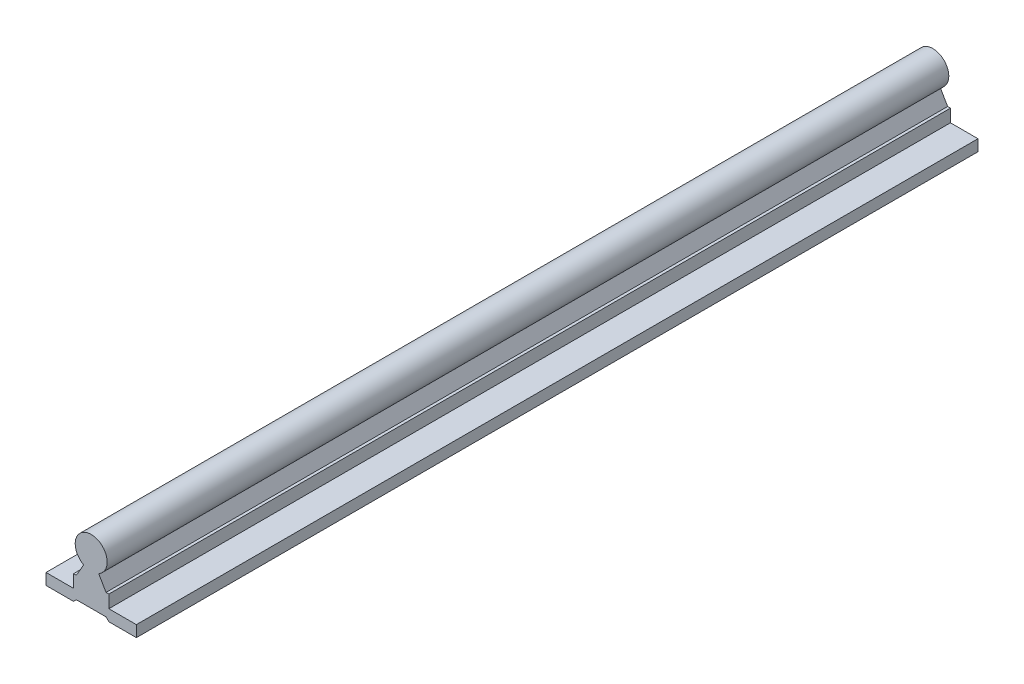
ISO-10303-21;
HEADER;
FILE_DESCRIPTION(('STEP AP214'),'2;1');
FILE_NAME('part.step','',(''),(''),'','','');
FILE_SCHEMA(('AUTOMOTIVE_DESIGN { 1 0 10303 214 1 1 1 1 }'));
ENDSEC;
DATA;
#1=APPLICATION_CONTEXT('core data for automotive mechanical design processes');
#2=APPLICATION_PROTOCOL_DEFINITION('international standard','automotive_design',2000,#1);
#3=PRODUCT_CONTEXT('',#1,'mechanical');
#4=PRODUCT('Part','Part','',(#3));
#5=PRODUCT_RELATED_PRODUCT_CATEGORY('part','',(#4));
#6=PRODUCT_DEFINITION_FORMATION('','',#4);
#7=PRODUCT_DEFINITION_CONTEXT('part definition',#1,'design');
#8=PRODUCT_DEFINITION('design','',#6,#7);
#9=PRODUCT_DEFINITION_SHAPE('','',#8);
#10=(LENGTH_UNIT() NAMED_UNIT(*) SI_UNIT(.MILLI.,.METRE.));
#11=(NAMED_UNIT(*) PLANE_ANGLE_UNIT() SI_UNIT($,.RADIAN.));
#12=(NAMED_UNIT(*) SI_UNIT($,.STERADIAN.) SOLID_ANGLE_UNIT());
#13=UNCERTAINTY_MEASURE_WITH_UNIT(LENGTH_MEASURE(1.E-05),#10,'distance_accuracy_value','');
#14=(GEOMETRIC_REPRESENTATION_CONTEXT(3) GLOBAL_UNCERTAINTY_ASSIGNED_CONTEXT((#13)) GLOBAL_UNIT_ASSIGNED_CONTEXT((#10,
#11,#12)) REPRESENTATION_CONTEXT('',''));
#15=CARTESIAN_POINT('',(0.,0.,0.));
#16=DIRECTION('',(0.,0.,1.));
#17=DIRECTION('',(1.,0.,0.));
#18=AXIS2_PLACEMENT_3D('',#15,#16,#17);
#19=CARTESIAN_POINT('',(-16.,0.,149.));
#20=DIRECTION('',(0.,1.,0.));
#21=DIRECTION('',(0.,0.,1.));
#22=AXIS2_PLACEMENT_3D('',#19,#20,#21);
#23=PLANE('',#22);
#24=DIRECTION('',(1.,0.,0.));
#25=VECTOR('',#24,1.);
#26=CARTESIAN_POINT('',(-16.,0.,-149.));
#27=LINE('',#26,#25);
#28=CARTESIAN_POINT('',(-16.,0.,-149.));
#29=VERTEX_POINT('',#28);
#30=CARTESIAN_POINT('',(-6.25,0.,-149.));
#31=VERTEX_POINT('',#30);
#32=EDGE_CURVE('E231',#29,#31,#27,.T.);
#33=ORIENTED_EDGE('',*,*,#32,.T.);
#34=DIRECTION('',(0.,0.,1.));
#35=VECTOR('',#34,1.);
#36=CARTESIAN_POINT('',(-6.25,0.,149.));
#37=LINE('',#36,#35);
#38=CARTESIAN_POINT('',(-6.25,0.,149.));
#39=VERTEX_POINT('',#38);
#40=EDGE_CURVE('E11',#31,#39,#37,.T.);
#41=ORIENTED_EDGE('',*,*,#40,.T.);
#42=DIRECTION('',(1.,0.,0.));
#43=VECTOR('',#42,1.);
#44=CARTESIAN_POINT('',(-16.,0.,149.));
#45=LINE('',#44,#43);
#46=CARTESIAN_POINT('',(-16.,0.,149.));
#47=VERTEX_POINT('',#46);
#48=EDGE_CURVE('E255',#47,#39,#45,.T.);
#49=ORIENTED_EDGE('',*,*,#48,.F.);
#50=DIRECTION('',(0.,0.,-1.));
#51=VECTOR('',#50,1.);
#52=CARTESIAN_POINT('',(-16.,0.,149.));
#53=LINE('',#52,#51);
#54=EDGE_CURVE('E173',#47,#29,#53,.T.);
#55=ORIENTED_EDGE('',*,*,#54,.T.);
#56=EDGE_LOOP('',(#33,#41,#49,#55));
#57=FACE_BOUND('',#56,.T.);
#58=ADVANCED_FACE('F35',(#57),#23,.F.);
#59=CARTESIAN_POINT('',(-16.,0.,149.));
#60=DIRECTION('',(1.,0.,0.));
#61=DIRECTION('',(0.,0.,-1.));
#62=AXIS2_PLACEMENT_3D('',#59,#60,#61);
#63=PLANE('',#62);
#64=DIRECTION('',(0.,-1.,0.));
#65=VECTOR('',#64,1.);
#66=CARTESIAN_POINT('',(-16.,0.,-149.));
#67=LINE('',#66,#65);
#68=CARTESIAN_POINT('',(-16.,4.,-149.));
#69=VERTEX_POINT('',#68);
#70=EDGE_CURVE('E159',#69,#29,#67,.T.);
#71=ORIENTED_EDGE('',*,*,#70,.T.);
#72=ORIENTED_EDGE('',*,*,#54,.F.);
#73=DIRECTION('',(0.,-1.,0.));
#74=VECTOR('',#73,1.);
#75=CARTESIAN_POINT('',(-16.,0.,149.));
#76=LINE('',#75,#74);
#77=CARTESIAN_POINT('',(-16.,4.,149.));
#78=VERTEX_POINT('',#77);
#79=EDGE_CURVE('E212',#78,#47,#76,.T.);
#80=ORIENTED_EDGE('',*,*,#79,.F.);
#81=DIRECTION('',(0.,0.,-1.));
#82=VECTOR('',#81,1.);
#83=CARTESIAN_POINT('',(-16.,4.,149.));
#84=LINE('',#83,#82);
#85=EDGE_CURVE('E206',#78,#69,#84,.T.);
#86=ORIENTED_EDGE('',*,*,#85,.T.);
#87=EDGE_LOOP('',(#71,#72,#80,#86));
#88=FACE_BOUND('',#87,.T.);
#89=ADVANCED_FACE('F271',(#88),#63,.F.);
#90=CARTESIAN_POINT('',(6.25,0.,149.));
#91=VERTEX_POINT('',#90);
#92=CARTESIAN_POINT('',(16.,0.,149.));
#93=VERTEX_POINT('',#92);
#94=EDGE_CURVE('E258',#91,#93,#45,.T.);
#95=ORIENTED_EDGE('',*,*,#94,.F.);
#96=DIRECTION('',(0.,0.,-1.));
#97=VECTOR('',#96,1.);
#98=CARTESIAN_POINT('',(6.25,0.,149.));
#99=LINE('',#98,#97);
#100=CARTESIAN_POINT('',(6.25,0.,-149.));
#101=VERTEX_POINT('',#100);
#102=EDGE_CURVE('E58',#91,#101,#99,.T.);
#103=ORIENTED_EDGE('',*,*,#102,.T.);
#104=CARTESIAN_POINT('',(16.,0.,-149.));
#105=VERTEX_POINT('',#104);
#106=EDGE_CURVE('E233',#101,#105,#27,.T.);
#107=ORIENTED_EDGE('',*,*,#106,.T.);
#108=DIRECTION('',(0.,0.,-1.));
#109=VECTOR('',#108,1.);
#110=CARTESIAN_POINT('',(16.,0.,149.));
#111=LINE('',#110,#109);
#112=EDGE_CURVE('E176',#93,#105,#111,.T.);
#113=ORIENTED_EDGE('',*,*,#112,.F.);
#114=EDGE_LOOP('',(#95,#103,#107,#113));
#115=FACE_BOUND('',#114,.T.);
#116=ADVANCED_FACE('F322',(#115),#23,.F.);
#117=CARTESIAN_POINT('',(16.,0.,149.));
#118=DIRECTION('',(-1.,0.,0.));
#119=DIRECTION('',(0.,0.,1.));
#120=AXIS2_PLACEMENT_3D('',#117,#118,#119);
#121=PLANE('',#120);
#122=DIRECTION('',(0.,1.,0.));
#123=VECTOR('',#122,1.);
#124=CARTESIAN_POINT('',(16.,0.,-149.));
#125=LINE('',#124,#123);
#126=CARTESIAN_POINT('',(16.,4.,-149.));
#127=VERTEX_POINT('',#126);
#128=EDGE_CURVE('E229',#105,#127,#125,.T.);
#129=ORIENTED_EDGE('',*,*,#128,.T.);
#130=DIRECTION('',(0.,0.,-1.));
#131=VECTOR('',#130,1.);
#132=CARTESIAN_POINT('',(16.,4.,149.));
#133=LINE('',#132,#131);
#134=CARTESIAN_POINT('',(16.,4.,149.));
#135=VERTEX_POINT('',#134);
#136=EDGE_CURVE('E179',#135,#127,#133,.T.);
#137=ORIENTED_EDGE('',*,*,#136,.F.);
#138=DIRECTION('',(0.,1.,0.));
#139=VECTOR('',#138,1.);
#140=CARTESIAN_POINT('',(16.,0.,149.));
#141=LINE('',#140,#139);
#142=EDGE_CURVE('E253',#93,#135,#141,.T.);
#143=ORIENTED_EDGE('',*,*,#142,.F.);
#144=ORIENTED_EDGE('',*,*,#112,.T.);
#145=EDGE_LOOP('',(#129,#137,#143,#144));
#146=FACE_BOUND('',#145,.T.);
#147=ADVANCED_FACE('F320',(#146),#121,.F.);
#148=CARTESIAN_POINT('',(6.25,4.,149.));
#149=DIRECTION('',(0.,-1.,0.));
#150=DIRECTION('',(0.,0.,-1.));
#151=AXIS2_PLACEMENT_3D('',#148,#149,#150);
#152=PLANE('',#151);
#153=DIRECTION('',(-1.,0.,0.));
#154=VECTOR('',#153,1.);
#155=CARTESIAN_POINT('',(6.25,4.,-149.));
#156=LINE('',#155,#154);
#157=CARTESIAN_POINT('',(6.25,4.,-149.));
#158=VERTEX_POINT('',#157);
#159=EDGE_CURVE('E227',#127,#158,#156,.T.);
#160=ORIENTED_EDGE('',*,*,#159,.T.);
#161=DIRECTION('',(0.,0.,-1.));
#162=VECTOR('',#161,1.);
#163=CARTESIAN_POINT('',(6.25,4.,149.));
#164=LINE('',#163,#162);
#165=CARTESIAN_POINT('',(6.25,4.,149.));
#166=VERTEX_POINT('',#165);
#167=EDGE_CURVE('E182',#166,#158,#164,.T.);
#168=ORIENTED_EDGE('',*,*,#167,.F.);
#169=DIRECTION('',(-1.,0.,0.));
#170=VECTOR('',#169,1.);
#171=CARTESIAN_POINT('',(6.25,4.,149.));
#172=LINE('',#171,#170);
#173=EDGE_CURVE('E251',#135,#166,#172,.T.);
#174=ORIENTED_EDGE('',*,*,#173,.F.);
#175=ORIENTED_EDGE('',*,*,#136,.T.);
#176=EDGE_LOOP('',(#160,#168,#174,#175));
#177=FACE_BOUND('',#176,.T.);
#178=ADVANCED_FACE('F315',(#177),#152,.F.);
#179=CARTESIAN_POINT('',(6.25,4.,149.));
#180=DIRECTION('',(-1.,0.,0.));
#181=DIRECTION('',(0.,-1.,0.));
#182=AXIS2_PLACEMENT_3D('',#179,#180,#181);
#183=PLANE('',#182);
#184=DIRECTION('',(0.,1.,0.));
#185=VECTOR('',#184,1.);
#186=CARTESIAN_POINT('',(6.25,4.,-149.));
#187=LINE('',#186,#185);
#188=CARTESIAN_POINT('',(6.25,8.5,-149.));
#189=VERTEX_POINT('',#188);
#190=EDGE_CURVE('E225',#158,#189,#187,.T.);
#191=ORIENTED_EDGE('',*,*,#190,.T.);
#192=DIRECTION('',(0.,0.,-1.));
#193=VECTOR('',#192,1.);
#194=CARTESIAN_POINT('',(6.25,8.5,149.));
#195=LINE('',#194,#193);
#196=CARTESIAN_POINT('',(6.25,8.5,149.));
#197=VERTEX_POINT('',#196);
#198=EDGE_CURVE('E185',#197,#189,#195,.T.);
#199=ORIENTED_EDGE('',*,*,#198,.F.);
#200=DIRECTION('',(0.,1.,0.));
#201=VECTOR('',#200,1.);
#202=CARTESIAN_POINT('',(6.25,4.,149.));
#203=LINE('',#202,#201);
#204=EDGE_CURVE('E249',#166,#197,#203,.T.);
#205=ORIENTED_EDGE('',*,*,#204,.F.);
#206=ORIENTED_EDGE('',*,*,#167,.T.);
#207=EDGE_LOOP('',(#191,#199,#205,#206));
#208=FACE_BOUND('',#207,.T.);
#209=ADVANCED_FACE('F310',(#208),#183,.F.);
#210=CARTESIAN_POINT('',(6.25,8.5,149.));
#211=DIRECTION('',(0.,-1.,0.));
#212=DIRECTION('',(0.,0.,-1.));
#213=AXIS2_PLACEMENT_3D('',#210,#211,#212);
#214=PLANE('',#213);
#215=DIRECTION('',(-1.,0.,0.));
#216=VECTOR('',#215,1.);
#217=CARTESIAN_POINT('',(6.25,8.5,-149.));
#218=LINE('',#217,#216);
#219=CARTESIAN_POINT('',(5.25,8.5,-149.));
#220=VERTEX_POINT('',#219);
#221=EDGE_CURVE('E223',#189,#220,#218,.T.);
#222=ORIENTED_EDGE('',*,*,#221,.T.);
#223=DIRECTION('',(0.,0.,-1.));
#224=VECTOR('',#223,1.);
#225=CARTESIAN_POINT('',(5.25,8.5,149.));
#226=LINE('',#225,#224);
#227=CARTESIAN_POINT('',(5.25,8.5,149.));
#228=VERTEX_POINT('',#227);
#229=EDGE_CURVE('E188',#228,#220,#226,.T.);
#230=ORIENTED_EDGE('',*,*,#229,.F.);
#231=DIRECTION('',(-1.,0.,0.));
#232=VECTOR('',#231,1.);
#233=CARTESIAN_POINT('',(6.25,8.5,149.));
#234=LINE('',#233,#232);
#235=EDGE_CURVE('E247',#197,#228,#234,.T.);
#236=ORIENTED_EDGE('',*,*,#235,.F.);
#237=ORIENTED_EDGE('',*,*,#198,.T.);
#238=EDGE_LOOP('',(#222,#230,#236,#237));
#239=FACE_BOUND('',#238,.T.);
#240=ADVANCED_FACE('F306',(#239),#214,.F.);
#241=CARTESIAN_POINT('',(5.25,8.5,149.));
#242=DIRECTION('',(-0.866025403784438,-0.500000000000001,0.));
#243=DIRECTION('',(0.500000000000001,-0.866025403784438,0.));
#244=AXIS2_PLACEMENT_3D('',#241,#242,#243);
#245=PLANE('',#244);
#246=DIRECTION('',(-0.500000000000001,0.866025403784438,0.));
#247=VECTOR('',#246,1.);
#248=CARTESIAN_POINT('',(5.25,8.5,-149.));
#249=LINE('',#248,#247);
#250=CARTESIAN_POINT('',(2.65192378864667,13.,-149.));
#251=VERTEX_POINT('',#250);
#252=EDGE_CURVE('E221',#220,#251,#249,.T.);
#253=ORIENTED_EDGE('',*,*,#252,.T.);
#254=DIRECTION('',(0.,0.,-1.));
#255=VECTOR('',#254,1.);
#256=CARTESIAN_POINT('',(2.65192378864667,13.,149.));
#257=LINE('',#256,#255);
#258=CARTESIAN_POINT('',(2.65192378864667,13.,149.));
#259=VERTEX_POINT('',#258);
#260=EDGE_CURVE('E191',#259,#251,#257,.T.);
#261=ORIENTED_EDGE('',*,*,#260,.F.);
#262=DIRECTION('',(-0.500000000000001,0.866025403784438,0.));
#263=VECTOR('',#262,1.);
#264=CARTESIAN_POINT('',(5.25,8.5,149.));
#265=LINE('',#264,#263);
#266=EDGE_CURVE('E245',#228,#259,#265,.T.);
#267=ORIENTED_EDGE('',*,*,#266,.F.);
#268=ORIENTED_EDGE('',*,*,#229,.T.);
#269=EDGE_LOOP('',(#253,#261,#267,#268));
#270=FACE_BOUND('',#269,.T.);
#271=ADVANCED_FACE('F301',(#270),#245,.F.);
#272=CARTESIAN_POINT('',(0.,18.,149.));
#273=DIRECTION('',(0.,0.,-1.));
#274=DIRECTION('',(-1.,0.,0.));
#275=AXIS2_PLACEMENT_3D('',#272,#273,#274);
#276=CYLINDRICAL_SURFACE('',#275,5.65974379109074);
#277=CARTESIAN_POINT('',(0.,18.,-149.));
#278=DIRECTION('',(0.,0.,1.));
#279=DIRECTION('',(-1.,0.,0.));
#280=AXIS2_PLACEMENT_3D('',#277,#278,#279);
#281=CIRCLE('',#280,5.65974379109074);
#282=CARTESIAN_POINT('',(-2.6519237886467,13.,-149.));
#283=VERTEX_POINT('',#282);
#284=EDGE_CURVE('E219',#251,#283,#281,.T.);
#285=ORIENTED_EDGE('',*,*,#284,.T.);
#286=DIRECTION('',(0.,0.,-1.));
#287=VECTOR('',#286,1.);
#288=CARTESIAN_POINT('',(-2.6519237886467,13.,149.));
#289=LINE('',#288,#287);
#290=CARTESIAN_POINT('',(-2.6519237886467,13.,149.));
#291=VERTEX_POINT('',#290);
#292=EDGE_CURVE('E194',#291,#283,#289,.T.);
#293=ORIENTED_EDGE('',*,*,#292,.F.);
#294=CARTESIAN_POINT('',(0.,18.,149.));
#295=DIRECTION('',(0.,0.,1.));
#296=DIRECTION('',(-1.,0.,0.));
#297=AXIS2_PLACEMENT_3D('',#294,#295,#296);
#298=CIRCLE('',#297,5.65974379109074);
#299=EDGE_CURVE('E243',#259,#291,#298,.T.);
#300=ORIENTED_EDGE('',*,*,#299,.F.);
#301=ORIENTED_EDGE('',*,*,#260,.T.);
#302=EDGE_LOOP('',(#285,#293,#300,#301));
#303=FACE_BOUND('',#302,.T.);
#304=ADVANCED_FACE('F295',(#303),#276,.T.);
#305=CARTESIAN_POINT('',(-2.6519237886467,13.,149.));
#306=DIRECTION('',(0.86602540378444,-0.499999999999998,0.));
#307=DIRECTION('',(0.499999999999998,0.86602540378444,0.));
#308=AXIS2_PLACEMENT_3D('',#305,#306,#307);
#309=PLANE('',#308);
#310=DIRECTION('',(-0.499999999999997,-0.86602540378444,0.));
#311=VECTOR('',#310,1.);
#312=CARTESIAN_POINT('',(-2.6519237886467,13.,-149.));
#313=LINE('',#312,#311);
#314=CARTESIAN_POINT('',(-5.25,8.5,-149.));
#315=VERTEX_POINT('',#314);
#316=EDGE_CURVE('E217',#283,#315,#313,.T.);
#317=ORIENTED_EDGE('',*,*,#316,.T.);
#318=DIRECTION('',(0.,0.,-1.));
#319=VECTOR('',#318,1.);
#320=CARTESIAN_POINT('',(-5.25,8.5,149.));
#321=LINE('',#320,#319);
#322=CARTESIAN_POINT('',(-5.25,8.5,149.));
#323=VERTEX_POINT('',#322);
#324=EDGE_CURVE('E197',#323,#315,#321,.T.);
#325=ORIENTED_EDGE('',*,*,#324,.F.);
#326=DIRECTION('',(-0.499999999999997,-0.86602540378444,0.));
#327=VECTOR('',#326,1.);
#328=CARTESIAN_POINT('',(-2.6519237886467,13.,149.));
#329=LINE('',#328,#327);
#330=EDGE_CURVE('E241',#291,#323,#329,.T.);
#331=ORIENTED_EDGE('',*,*,#330,.F.);
#332=ORIENTED_EDGE('',*,*,#292,.T.);
#333=EDGE_LOOP('',(#317,#325,#331,#332));
#334=FACE_BOUND('',#333,.T.);
#335=ADVANCED_FACE('F291',(#334),#309,.F.);
#336=CARTESIAN_POINT('',(-6.25,8.5,149.));
#337=DIRECTION('',(0.,-1.,0.));
#338=DIRECTION('',(0.,0.,-1.));
#339=AXIS2_PLACEMENT_3D('',#336,#337,#338);
#340=PLANE('',#339);
#341=DIRECTION('',(-1.,0.,0.));
#342=VECTOR('',#341,1.);
#343=CARTESIAN_POINT('',(-6.25,8.5,-149.));
#344=LINE('',#343,#342);
#345=CARTESIAN_POINT('',(-6.25,8.5,-149.));
#346=VERTEX_POINT('',#345);
#347=EDGE_CURVE('E215',#315,#346,#344,.T.);
#348=ORIENTED_EDGE('',*,*,#347,.T.);
#349=DIRECTION('',(0.,0.,-1.));
#350=VECTOR('',#349,1.);
#351=CARTESIAN_POINT('',(-6.25,8.5,149.));
#352=LINE('',#351,#350);
#353=CARTESIAN_POINT('',(-6.25,8.5,149.));
#354=VERTEX_POINT('',#353);
#355=EDGE_CURVE('E200',#354,#346,#352,.T.);
#356=ORIENTED_EDGE('',*,*,#355,.F.);
#357=DIRECTION('',(-1.,0.,0.));
#358=VECTOR('',#357,1.);
#359=CARTESIAN_POINT('',(-6.25,8.5,149.));
#360=LINE('',#359,#358);
#361=EDGE_CURVE('E239',#323,#354,#360,.T.);
#362=ORIENTED_EDGE('',*,*,#361,.F.);
#363=ORIENTED_EDGE('',*,*,#324,.T.);
#364=EDGE_LOOP('',(#348,#356,#362,#363));
#365=FACE_BOUND('',#364,.T.);
#366=ADVANCED_FACE('F286',(#365),#340,.F.);
#367=CARTESIAN_POINT('',(-6.25,4.,149.));
#368=DIRECTION('',(1.,0.,0.));
#369=DIRECTION('',(0.,0.,-1.));
#370=AXIS2_PLACEMENT_3D('',#367,#368,#369);
#371=PLANE('',#370);
#372=DIRECTION('',(0.,-1.,0.));
#373=VECTOR('',#372,1.);
#374=CARTESIAN_POINT('',(-6.25,4.,-149.));
#375=LINE('',#374,#373);
#376=CARTESIAN_POINT('',(-6.25,4.,-149.));
#377=VERTEX_POINT('',#376);
#378=EDGE_CURVE('E213',#346,#377,#375,.T.);
#379=ORIENTED_EDGE('',*,*,#378,.T.);
#380=DIRECTION('',(0.,0.,-1.));
#381=VECTOR('',#380,1.);
#382=CARTESIAN_POINT('',(-6.25,4.,149.));
#383=LINE('',#382,#381);
#384=CARTESIAN_POINT('',(-6.25,4.,149.));
#385=VERTEX_POINT('',#384);
#386=EDGE_CURVE('E203',#385,#377,#383,.T.);
#387=ORIENTED_EDGE('',*,*,#386,.F.);
#388=DIRECTION('',(0.,-1.,0.));
#389=VECTOR('',#388,1.);
#390=CARTESIAN_POINT('',(-6.25,4.,149.));
#391=LINE('',#390,#389);
#392=EDGE_CURVE('E237',#354,#385,#391,.T.);
#393=ORIENTED_EDGE('',*,*,#392,.F.);
#394=ORIENTED_EDGE('',*,*,#355,.T.);
#395=EDGE_LOOP('',(#379,#387,#393,#394));
#396=FACE_BOUND('',#395,.T.);
#397=ADVANCED_FACE('F280',(#396),#371,.F.);
#398=CARTESIAN_POINT('',(-16.,4.,149.));
#399=DIRECTION('',(0.,-1.,0.));
#400=DIRECTION('',(0.,0.,-1.));
#401=AXIS2_PLACEMENT_3D('',#398,#399,#400);
#402=PLANE('',#401);
#403=DIRECTION('',(-1.,0.,0.));
#404=VECTOR('',#403,1.);
#405=CARTESIAN_POINT('',(-16.,4.,-149.));
#406=LINE('',#405,#404);
#407=EDGE_CURVE('E210',#377,#69,#406,.T.);
#408=ORIENTED_EDGE('',*,*,#407,.T.);
#409=ORIENTED_EDGE('',*,*,#85,.F.);
#410=DIRECTION('',(-1.,0.,0.));
#411=VECTOR('',#410,1.);
#412=CARTESIAN_POINT('',(-16.,4.,149.));
#413=LINE('',#412,#411);
#414=EDGE_CURVE('E209',#385,#78,#413,.T.);
#415=ORIENTED_EDGE('',*,*,#414,.F.);
#416=ORIENTED_EDGE('',*,*,#386,.T.);
#417=EDGE_LOOP('',(#408,#409,#415,#416));
#418=FACE_BOUND('',#417,.T.);
#419=ADVANCED_FACE('F276',(#418),#402,.F.);
#420=CARTESIAN_POINT('',(0.,18.,149.));
#421=DIRECTION('',(0.,0.,-1.));
#422=DIRECTION('',(-1.,0.,0.));
#423=AXIS2_PLACEMENT_3D('',#420,#421,#422);
#424=PLANE('',#423);
#425=DIRECTION('',(-1.,0.,0.));
#426=VECTOR('',#425,1.);
#427=CARTESIAN_POINT('',(-5.25,1.,149.));
#428=LINE('',#427,#426);
#429=CARTESIAN_POINT('',(5.25,1.,149.));
#430=VERTEX_POINT('',#429);
#431=CARTESIAN_POINT('',(-5.25,1.,149.));
#432=VERTEX_POINT('',#431);
#433=EDGE_CURVE('E157',#430,#432,#428,.T.);
#434=ORIENTED_EDGE('',*,*,#433,.F.);
#435=DIRECTION('',(-0.707106781186547,0.707106781186548,0.));
#436=VECTOR('',#435,1.);
#437=CARTESIAN_POINT('',(5.25,1.,149.));
#438=LINE('',#437,#436);
#439=EDGE_CURVE('E167',#430,#91,#438,.F.);
#440=ORIENTED_EDGE('',*,*,#439,.T.);
#441=ORIENTED_EDGE('',*,*,#94,.T.);
#442=ORIENTED_EDGE('',*,*,#142,.T.);
#443=ORIENTED_EDGE('',*,*,#173,.T.);
#444=ORIENTED_EDGE('',*,*,#204,.T.);
#445=ORIENTED_EDGE('',*,*,#235,.T.);
#446=ORIENTED_EDGE('',*,*,#266,.T.);
#447=ORIENTED_EDGE('',*,*,#299,.T.);
#448=ORIENTED_EDGE('',*,*,#330,.T.);
#449=ORIENTED_EDGE('',*,*,#361,.T.);
#450=ORIENTED_EDGE('',*,*,#392,.T.);
#451=ORIENTED_EDGE('',*,*,#414,.T.);
#452=ORIENTED_EDGE('',*,*,#79,.T.);
#453=ORIENTED_EDGE('',*,*,#48,.T.);
#454=DIRECTION('',(-0.707106781186548,-0.707106781186547,0.));
#455=VECTOR('',#454,1.);
#456=CARTESIAN_POINT('',(-6.25,0.,149.));
#457=LINE('',#456,#455);
#458=EDGE_CURVE('E171',#39,#432,#457,.F.);
#459=ORIENTED_EDGE('',*,*,#458,.T.);
#460=EDGE_LOOP('',(#434,#440,#441,#442,#443,#444,#445,#446,#447,#448,#449,#450,#451,#452,#453,#459));
#461=FACE_BOUND('',#460,.T.);
#462=ADVANCED_FACE('F264',(#461),#424,.F.);
#463=CARTESIAN_POINT('',(0.,18.,-149.));
#464=DIRECTION('',(0.,0.,-1.));
#465=DIRECTION('',(-1.,0.,0.));
#466=AXIS2_PLACEMENT_3D('',#463,#464,#465);
#467=PLANE('',#466);
#468=ORIENTED_EDGE('',*,*,#106,.F.);
#469=DIRECTION('',(0.707106781186547,-0.707106781186548,0.));
#470=VECTOR('',#469,1.);
#471=CARTESIAN_POINT('',(-5.87500000000001,12.125,-149.));
#472=LINE('',#471,#470);
#473=CARTESIAN_POINT('',(5.25,0.999999999999997,-149.));
#474=VERTEX_POINT('',#473);
#475=EDGE_CURVE('E43',#101,#474,#472,.F.);
#476=ORIENTED_EDGE('',*,*,#475,.T.);
#477=DIRECTION('',(-1.,0.,0.));
#478=VECTOR('',#477,1.);
#479=CARTESIAN_POINT('',(-5.25,1.,-149.));
#480=LINE('',#479,#478);
#481=CARTESIAN_POINT('',(-5.25,1.,-149.));
#482=VERTEX_POINT('',#481);
#483=EDGE_CURVE('E154',#474,#482,#480,.T.);
#484=ORIENTED_EDGE('',*,*,#483,.T.);
#485=DIRECTION('',(0.707106781186548,0.707106781186547,0.));
#486=VECTOR('',#485,1.);
#487=CARTESIAN_POINT('',(5.87499999999999,12.125,-149.));
#488=LINE('',#487,#486);
#489=EDGE_CURVE('E50',#482,#31,#488,.F.);
#490=ORIENTED_EDGE('',*,*,#489,.T.);
#491=ORIENTED_EDGE('',*,*,#32,.F.);
#492=ORIENTED_EDGE('',*,*,#70,.F.);
#493=ORIENTED_EDGE('',*,*,#407,.F.);
#494=ORIENTED_EDGE('',*,*,#378,.F.);
#495=ORIENTED_EDGE('',*,*,#347,.F.);
#496=ORIENTED_EDGE('',*,*,#316,.F.);
#497=ORIENTED_EDGE('',*,*,#284,.F.);
#498=ORIENTED_EDGE('',*,*,#252,.F.);
#499=ORIENTED_EDGE('',*,*,#221,.F.);
#500=ORIENTED_EDGE('',*,*,#190,.F.);
#501=ORIENTED_EDGE('',*,*,#159,.F.);
#502=ORIENTED_EDGE('',*,*,#128,.F.);
#503=EDGE_LOOP('',(#468,#476,#484,#490,#491,#492,#493,#494,#495,#496,#497,#498,#499,#500,#501,#502));
#504=FACE_BOUND('',#503,.T.);
#505=ADVANCED_FACE('F162',(#504),#467,.T.);
#506=CARTESIAN_POINT('',(-5.25,1.,-149.));
#507=DIRECTION('',(0.,1.,0.));
#508=DIRECTION('',(0.,0.,1.));
#509=AXIS2_PLACEMENT_3D('',#506,#507,#508);
#510=PLANE('',#509);
#511=ORIENTED_EDGE('',*,*,#433,.T.);
#512=DIRECTION('',(0.,0.,1.));
#513=VECTOR('',#512,1.);
#514=CARTESIAN_POINT('',(-5.25,1.,-149.));
#515=LINE('',#514,#513);
#516=EDGE_CURVE('E151',#482,#432,#515,.T.);
#517=ORIENTED_EDGE('',*,*,#516,.F.);
#518=ORIENTED_EDGE('',*,*,#483,.F.);
#519=DIRECTION('',(0.,0.,1.));
#520=VECTOR('',#519,1.);
#521=CARTESIAN_POINT('',(5.25,1.,-149.));
#522=LINE('',#521,#520);
#523=EDGE_CURVE('E160',#474,#430,#522,.T.);
#524=ORIENTED_EDGE('',*,*,#523,.T.);
#525=EDGE_LOOP('',(#511,#517,#518,#524));
#526=FACE_BOUND('',#525,.T.);
#527=ADVANCED_FACE('F152',(#526),#510,.F.);
#528=CARTESIAN_POINT('',(5.25,1.,-149.));
#529=DIRECTION('',(0.707106781186548,0.707106781186547,0.));
#530=DIRECTION('',(0.,0.,1.));
#531=AXIS2_PLACEMENT_3D('',#528,#529,#530);
#532=PLANE('',#531);
#533=ORIENTED_EDGE('',*,*,#475,.F.);
#534=ORIENTED_EDGE('',*,*,#102,.F.);
#535=ORIENTED_EDGE('',*,*,#439,.F.);
#536=ORIENTED_EDGE('',*,*,#523,.F.);
#537=EDGE_LOOP('',(#533,#534,#535,#536));
#538=FACE_BOUND('',#537,.T.);
#539=ADVANCED_FACE('F323',(#538),#532,.F.);
#540=CARTESIAN_POINT('',(-6.25,0.,149.));
#541=DIRECTION('',(-0.707106781186547,0.707106781186548,0.));
#542=DIRECTION('',(0.,0.,1.));
#543=AXIS2_PLACEMENT_3D('',#540,#541,#542);
#544=PLANE('',#543);
#545=ORIENTED_EDGE('',*,*,#489,.F.);
#546=ORIENTED_EDGE('',*,*,#516,.T.);
#547=ORIENTED_EDGE('',*,*,#458,.F.);
#548=ORIENTED_EDGE('',*,*,#40,.F.);
#549=EDGE_LOOP('',(#545,#546,#547,#548));
#550=FACE_BOUND('',#549,.T.);
#551=ADVANCED_FACE('F37',(#550),#544,.F.);
#552=CLOSED_SHELL('',(#58,#89,#116,#147,#178,#209,#240,#271,#304,#335,#366,#397,#419,#462,#505,
#527,#539,#551));
#553=MANIFOLD_SOLID_BREP('B2',#552);
#554=ADVANCED_BREP_SHAPE_REPRESENTATION('',(#18,#553),#14);
#555=SHAPE_DEFINITION_REPRESENTATION(#9,#554);
ENDSEC;
END-ISO-10303-21;
